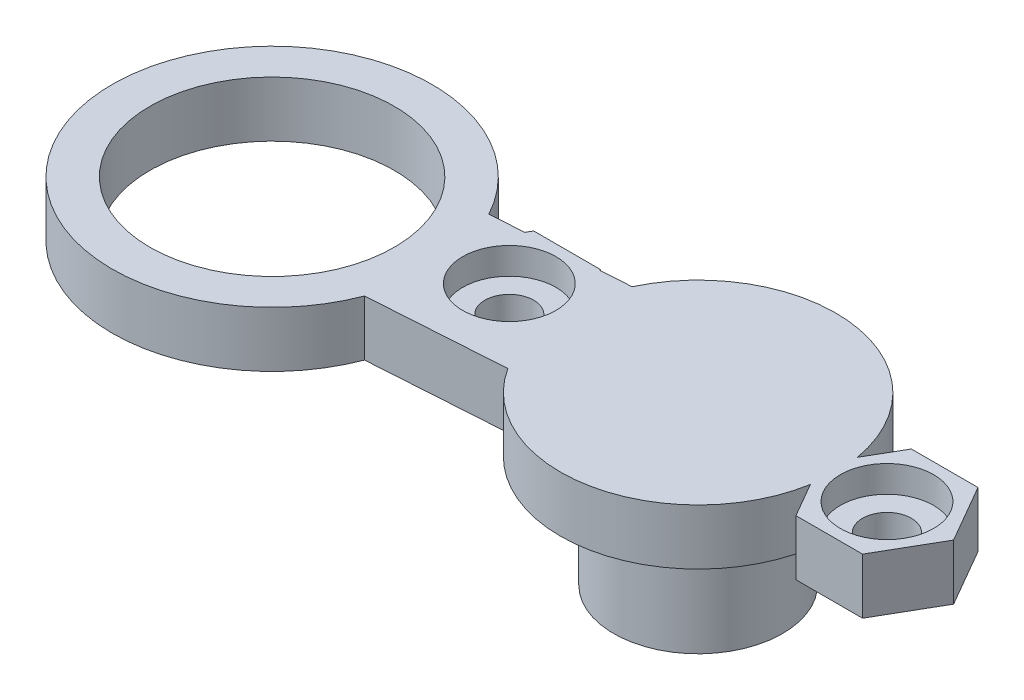
ISO-10303-21;
HEADER;
FILE_DESCRIPTION(('STEP AP214'),'2;1');
FILE_NAME('part.step','',(''),(''),'','','');
FILE_SCHEMA(('AUTOMOTIVE_DESIGN { 1 0 10303 214 1 1 1 1 }'));
ENDSEC;
DATA;
#1=APPLICATION_CONTEXT('core data for automotive mechanical design processes');
#2=APPLICATION_PROTOCOL_DEFINITION('international standard','automotive_design',2000,#1);
#3=PRODUCT_CONTEXT('',#1,'mechanical');
#4=PRODUCT('Part','Part','',(#3));
#5=PRODUCT_RELATED_PRODUCT_CATEGORY('part','',(#4));
#6=PRODUCT_DEFINITION_FORMATION('','',#4);
#7=PRODUCT_DEFINITION_CONTEXT('part definition',#1,'design');
#8=PRODUCT_DEFINITION('design','',#6,#7);
#9=PRODUCT_DEFINITION_SHAPE('','',#8);
#10=(LENGTH_UNIT() NAMED_UNIT(*) SI_UNIT(.MILLI.,.METRE.));
#11=(NAMED_UNIT(*) PLANE_ANGLE_UNIT() SI_UNIT($,.RADIAN.));
#12=(NAMED_UNIT(*) SI_UNIT($,.STERADIAN.) SOLID_ANGLE_UNIT());
#13=UNCERTAINTY_MEASURE_WITH_UNIT(LENGTH_MEASURE(1.E-05),#10,'distance_accuracy_value','');
#14=(GEOMETRIC_REPRESENTATION_CONTEXT(3) GLOBAL_UNCERTAINTY_ASSIGNED_CONTEXT((#13)) GLOBAL_UNIT_ASSIGNED_CONTEXT((#10,
#11,#12)) REPRESENTATION_CONTEXT('',''));
#15=CARTESIAN_POINT('',(0.,0.,0.));
#16=DIRECTION('',(0.,0.,1.));
#17=DIRECTION('',(1.,0.,0.));
#18=AXIS2_PLACEMENT_3D('',#15,#16,#17);
#19=CARTESIAN_POINT('',(-64.7916512459885,108.75,30.));
#20=DIRECTION('',(0.,-1.,0.));
#21=DIRECTION('',(0.,0.,1.));
#22=AXIS2_PLACEMENT_3D('',#19,#20,#21);
#23=CYLINDRICAL_SURFACE('',#22,1.1);
#24=CARTESIAN_POINT('',(-64.7916512459885,106.,30.));
#25=DIRECTION('',(0.,-1.,0.));
#26=DIRECTION('',(0.,0.,-1.));
#27=AXIS2_PLACEMENT_3D('',#24,#25,#26);
#28=CIRCLE('',#27,1.1);
#29=CARTESIAN_POINT('',(-64.7916512459885,106.,28.9));
#30=VERTEX_POINT('',#29);
#31=EDGE_CURVE('E205',#30,#30,#28,.F.);
#32=ORIENTED_EDGE('',*,*,#31,.F.);
#33=EDGE_LOOP('',(#32));
#34=FACE_BOUND('',#33,.T.);
#35=CARTESIAN_POINT('',(-64.7916512459885,107.3,30.));
#36=DIRECTION('',(0.,-1.,0.));
#37=DIRECTION('',(0.,0.,-1.));
#38=AXIS2_PLACEMENT_3D('',#35,#36,#37);
#39=CIRCLE('',#38,1.1);
#40=CARTESIAN_POINT('',(-64.7916512459885,107.3,28.9));
#41=VERTEX_POINT('',#40);
#42=EDGE_CURVE('E209',#41,#41,#39,.T.);
#43=ORIENTED_EDGE('',*,*,#42,.F.);
#44=EDGE_LOOP('',(#43));
#45=FACE_BOUND('',#44,.T.);
#46=ADVANCED_FACE('F41',(#34,#45),#23,.F.);
#47=CARTESIAN_POINT('',(-47.7916512459885,108.75,30.));
#48=DIRECTION('',(0.,-1.,0.));
#49=DIRECTION('',(0.,0.,1.));
#50=AXIS2_PLACEMENT_3D('',#47,#48,#49);
#51=CYLINDRICAL_SURFACE('',#50,1.1);
#52=CARTESIAN_POINT('',(-47.7916512459885,106.,30.));
#53=DIRECTION('',(0.,-1.,0.));
#54=DIRECTION('',(0.,0.,-1.));
#55=AXIS2_PLACEMENT_3D('',#52,#53,#54);
#56=CIRCLE('',#55,1.1);
#57=CARTESIAN_POINT('',(-47.7916512459885,106.,28.9));
#58=VERTEX_POINT('',#57);
#59=EDGE_CURVE('E192',#58,#58,#56,.F.);
#60=ORIENTED_EDGE('',*,*,#59,.F.);
#61=EDGE_LOOP('',(#60));
#62=FACE_BOUND('',#61,.T.);
#63=CARTESIAN_POINT('',(-47.7916512459885,107.3,30.));
#64=DIRECTION('',(0.,-1.,0.));
#65=DIRECTION('',(0.,0.,-1.));
#66=AXIS2_PLACEMENT_3D('',#63,#64,#65);
#67=CIRCLE('',#66,1.1);
#68=CARTESIAN_POINT('',(-47.7916512459885,107.3,28.9));
#69=VERTEX_POINT('',#68);
#70=EDGE_CURVE('E198',#69,#69,#67,.T.);
#71=ORIENTED_EDGE('',*,*,#70,.F.);
#72=EDGE_LOOP('',(#71));
#73=FACE_BOUND('',#72,.T.);
#74=ADVANCED_FACE('F355',(#62,#73),#51,.F.);
#75=CARTESIAN_POINT('',(-74.4873857240542,108.5,28.1833066771346));
#76=DIRECTION('',(0.0652448260218996,0.,0.997869286368396));
#77=DIRECTION('',(0.997869286368396,0.,-0.0652448260218996));
#78=AXIS2_PLACEMENT_3D('',#75,#76,#77);
#79=PLANE('',#78);
#80=DIRECTION('',(0.,-1.,0.));
#81=VECTOR('',#80,1.);
#82=CARTESIAN_POINT('',(-67.9561044602363,108.5,27.7562644627092));
#83=LINE('',#82,#81);
#84=CARTESIAN_POINT('',(-67.9561044602363,106.,27.7562644627092));
#85=VERTEX_POINT('',#84);
#86=CARTESIAN_POINT('',(-67.9561044602363,108.5,27.7562644627092));
#87=VERTEX_POINT('',#86);
#88=EDGE_CURVE('E236',#85,#87,#83,.F.);
#89=ORIENTED_EDGE('',*,*,#88,.T.);
#90=DIRECTION('',(0.997869286368396,0.,-0.0652448260218996));
#91=VECTOR('',#90,1.);
#92=CARTESIAN_POINT('',(-74.4873857240542,108.5,28.1833066771346));
#93=LINE('',#92,#91);
#94=CARTESIAN_POINT('',(-66.4389583443347,108.5,27.6570671672978));
#95=VERTEX_POINT('',#94);
#96=EDGE_CURVE('E234',#87,#95,#93,.T.);
#97=ORIENTED_EDGE('',*,*,#96,.T.);
#98=DIRECTION('',(0.,1.,0.));
#99=VECTOR('',#98,1.);
#100=CARTESIAN_POINT('',(-66.4389583443347,108.5,27.6570671672978));
#101=LINE('',#100,#99);
#102=CARTESIAN_POINT('',(-66.4389583443347,106.,27.6570671672978));
#103=VERTEX_POINT('',#102);
#104=EDGE_CURVE('E187',#103,#95,#101,.T.);
#105=ORIENTED_EDGE('',*,*,#104,.F.);
#106=DIRECTION('',(0.997869286368396,0.,-0.0652448260218996));
#107=VECTOR('',#106,1.);
#108=CARTESIAN_POINT('',(-74.4873857240542,106.,28.1833066771346));
#109=LINE('',#108,#107);
#110=EDGE_CURVE('E243',#85,#103,#109,.T.);
#111=ORIENTED_EDGE('',*,*,#110,.F.);
#112=EDGE_LOOP('',(#89,#97,#105,#111));
#113=FACE_BOUND('',#112,.T.);
#114=ADVANCED_FACE('F363',(#113),#79,.F.);
#115=CARTESIAN_POINT('',(-56.0959167679228,108.5,32.9936078591052));
#116=DIRECTION('',(-0.0652448260218995,0.,-0.997869286368396));
#117=DIRECTION('',(-0.997869286368396,0.,0.0652448260218995));
#118=AXIS2_PLACEMENT_3D('',#115,#116,#117);
#119=PLANE('',#118);
#120=DIRECTION('',(0.,-1.,0.));
#121=VECTOR('',#120,1.);
#122=CARTESIAN_POINT('',(-67.5646355041049,108.5,33.7434801809195));
#123=LINE('',#122,#121);
#124=CARTESIAN_POINT('',(-67.5646355041049,108.5,33.7434801809195));
#125=VERTEX_POINT('',#124);
#126=CARTESIAN_POINT('',(-67.5646355041049,106.,33.7434801809195));
#127=VERTEX_POINT('',#126);
#128=EDGE_CURVE('E49',#125,#127,#123,.T.);
#129=ORIENTED_EDGE('',*,*,#128,.T.);
#130=DIRECTION('',(-0.997869286368396,0.,0.0652448260218995));
#131=VECTOR('',#130,1.);
#132=CARTESIAN_POINT('',(-56.0959167679228,106.,32.9936078591052));
#133=LINE('',#132,#131);
#134=CARTESIAN_POINT('',(-61.5102197920638,106.,33.3476174109229));
#135=VERTEX_POINT('',#134);
#136=EDGE_CURVE('E252',#135,#127,#133,.T.);
#137=ORIENTED_EDGE('',*,*,#136,.F.);
#138=DIRECTION('',(0.,-1.,0.));
#139=VECTOR('',#138,1.);
#140=CARTESIAN_POINT('',(-61.5102197920638,108.5,33.3476174109229));
#141=LINE('',#140,#139);
#142=CARTESIAN_POINT('',(-61.5102197920638,108.5,33.3476174109229));
#143=VERTEX_POINT('',#142);
#144=EDGE_CURVE('E172',#143,#135,#141,.T.);
#145=ORIENTED_EDGE('',*,*,#144,.F.);
#146=DIRECTION('',(-0.997869286368396,0.,0.0652448260218995));
#147=VECTOR('',#146,1.);
#148=CARTESIAN_POINT('',(-56.0959167679228,108.5,32.9936078591052));
#149=LINE('',#148,#147);
#150=EDGE_CURVE('E233',#143,#125,#149,.T.);
#151=ORIENTED_EDGE('',*,*,#150,.T.);
#152=EDGE_LOOP('',(#129,#137,#145,#151));
#153=FACE_BOUND('',#152,.T.);
#154=ADVANCED_FACE('F239',(#153),#119,.F.);
#155=CARTESIAN_POINT('',(-56.2916512459885,108.5,30.));
#156=DIRECTION('',(0.,-1.,0.));
#157=DIRECTION('',(0.,0.,1.));
#158=AXIS2_PLACEMENT_3D('',#155,#156,#157);
#159=CYLINDRICAL_SURFACE('',#158,6.2);
#160=DIRECTION('',(0.,-1.,0.));
#161=VECTOR('',#160,1.);
#162=CARTESIAN_POINT('',(-61.9016887481952,108.5,27.3604016927125));
#163=LINE('',#162,#161);
#164=CARTESIAN_POINT('',(-61.9016887481952,106.,27.3604016927125));
#165=VERTEX_POINT('',#164);
#166=CARTESIAN_POINT('',(-61.9016887481952,108.5,27.3604016927125));
#167=VERTEX_POINT('',#166);
#168=EDGE_CURVE('E179',#165,#167,#163,.F.);
#169=ORIENTED_EDGE('',*,*,#168,.T.);
#170=CARTESIAN_POINT('',(-56.2916512459885,108.5,30.));
#171=DIRECTION('',(0.,-1.,0.));
#172=DIRECTION('',(0.,0.,-1.));
#173=AXIS2_PLACEMENT_3D('',#170,#171,#172);
#174=CIRCLE('',#173,6.2);
#175=CARTESIAN_POINT('',(-50.1821802837419,108.5,28.944365327651));
#176=VERTEX_POINT('',#175);
#177=EDGE_CURVE('E336',#167,#176,#174,.T.);
#178=ORIENTED_EDGE('',*,*,#177,.T.);
#179=DIRECTION('',(0.,-1.,0.));
#180=VECTOR('',#179,1.);
#181=CARTESIAN_POINT('',(-50.1821802837419,108.5,28.944365327651));
#182=LINE('',#181,#180);
#183=CARTESIAN_POINT('',(-50.1821802837419,106.,28.944365327651));
#184=VERTEX_POINT('',#183);
#185=EDGE_CURVE('E329',#176,#184,#182,.T.);
#186=ORIENTED_EDGE('',*,*,#185,.T.);
#187=CARTESIAN_POINT('',(-56.2916512459885,106.,30.));
#188=DIRECTION('',(0.,-1.,0.));
#189=DIRECTION('',(0.,0.,-1.));
#190=AXIS2_PLACEMENT_3D('',#187,#188,#189);
#191=CIRCLE('',#190,6.2);
#192=EDGE_CURVE('E333',#165,#184,#191,.T.);
#193=ORIENTED_EDGE('',*,*,#192,.F.);
#194=EDGE_LOOP('',(#169,#178,#186,#193));
#195=FACE_BOUND('',#194,.T.);
#196=ADVANCED_FACE('F388',(#195),#159,.T.);
#197=ORIENTED_EDGE('',*,*,#144,.T.);
#198=CARTESIAN_POINT('',(-50.1821802837419,106.,31.055634672349));
#199=VERTEX_POINT('',#198);
#200=EDGE_CURVE('E251',#199,#135,#191,.T.);
#201=ORIENTED_EDGE('',*,*,#200,.F.);
#202=DIRECTION('',(0.,-1.,0.));
#203=VECTOR('',#202,1.);
#204=CARTESIAN_POINT('',(-50.1821802837419,108.5,31.055634672349));
#205=LINE('',#204,#203);
#206=CARTESIAN_POINT('',(-50.1821802837419,108.5,31.055634672349));
#207=VERTEX_POINT('',#206);
#208=EDGE_CURVE('E331',#199,#207,#205,.F.);
#209=ORIENTED_EDGE('',*,*,#208,.T.);
#210=EDGE_CURVE('E335',#207,#143,#174,.T.);
#211=ORIENTED_EDGE('',*,*,#210,.T.);
#212=EDGE_LOOP('',(#197,#201,#209,#211));
#213=FACE_BOUND('',#212,.T.);
#214=ADVANCED_FACE('F404',(#213),#159,.T.);
#215=CARTESIAN_POINT('',(-63.2916512459885,108.5,27.4019237886467));
#216=DIRECTION('',(-0.866025403784438,0.,0.500000000000002));
#217=DIRECTION('',(0.500000000000002,0.,0.866025403784438));
#218=AXIS2_PLACEMENT_3D('',#215,#216,#217);
#219=PLANE('',#218);
#220=DIRECTION('',(0.,-1.,0.));
#221=VECTOR('',#220,1.);
#222=CARTESIAN_POINT('',(-63.264190219979,108.5,27.4494876809231));
#223=LINE('',#222,#221);
#224=CARTESIAN_POINT('',(-63.264190219979,108.5,27.4494876809231));
#225=VERTEX_POINT('',#224);
#226=CARTESIAN_POINT('',(-63.264190219979,106.,27.4494876809231));
#227=VERTEX_POINT('',#226);
#228=EDGE_CURVE('E261',#225,#227,#223,.T.);
#229=ORIENTED_EDGE('',*,*,#228,.T.);
#230=DIRECTION('',(0.500000000000002,0.,0.866025403784437));
#231=VECTOR('',#230,1.);
#232=CARTESIAN_POINT('',(-63.2916512459885,106.,27.4019237886467));
#233=LINE('',#232,#231);
#234=CARTESIAN_POINT('',(-63.2916512459885,106.,27.4019237886467));
#235=VERTEX_POINT('',#234);
#236=EDGE_CURVE('E173',#235,#227,#233,.T.);
#237=ORIENTED_EDGE('',*,*,#236,.F.);
#238=DIRECTION('',(0.,-1.,0.));
#239=VECTOR('',#238,1.);
#240=CARTESIAN_POINT('',(-63.2916512459885,108.5,27.4019237886467));
#241=LINE('',#240,#239);
#242=CARTESIAN_POINT('',(-63.2916512459885,108.5,27.4019237886467));
#243=VERTEX_POINT('',#242);
#244=EDGE_CURVE('E274',#243,#235,#241,.T.);
#245=ORIENTED_EDGE('',*,*,#244,.F.);
#246=DIRECTION('',(0.500000000000002,0.,0.866025403784437));
#247=VECTOR('',#246,1.);
#248=CARTESIAN_POINT('',(-63.2916512459885,108.5,27.4019237886467));
#249=LINE('',#248,#247);
#250=EDGE_CURVE('E266',#243,#225,#249,.T.);
#251=ORIENTED_EDGE('',*,*,#250,.T.);
#252=EDGE_LOOP('',(#229,#237,#245,#251));
#253=FACE_BOUND('',#252,.T.);
#254=ADVANCED_FACE('F400',(#253),#219,.F.);
#255=CARTESIAN_POINT('',(-67.7916512459885,108.5,30.));
#256=DIRECTION('',(0.866025403784439,0.,0.5));
#257=DIRECTION('',(0.5,0.,-0.866025403784439));
#258=AXIS2_PLACEMENT_3D('',#255,#256,#257);
#259=PLANE('',#258);
#260=ORIENTED_EDGE('',*,*,#104,.T.);
#261=DIRECTION('',(0.5,0.,-0.866025403784439));
#262=VECTOR('',#261,1.);
#263=CARTESIAN_POINT('',(-67.7916512459885,108.5,30.));
#264=LINE('',#263,#262);
#265=CARTESIAN_POINT('',(-66.2916512459885,108.5,27.4019237886467));
#266=VERTEX_POINT('',#265);
#267=EDGE_CURVE('E268',#95,#266,#264,.T.);
#268=ORIENTED_EDGE('',*,*,#267,.T.);
#269=DIRECTION('',(0.,-1.,0.));
#270=VECTOR('',#269,1.);
#271=CARTESIAN_POINT('',(-66.2916512459885,108.5,27.4019237886467));
#272=LINE('',#271,#270);
#273=CARTESIAN_POINT('',(-66.2916512459885,106.,27.4019237886467));
#274=VERTEX_POINT('',#273);
#275=EDGE_CURVE('E281',#266,#274,#272,.T.);
#276=ORIENTED_EDGE('',*,*,#275,.T.);
#277=DIRECTION('',(0.5,0.,-0.866025403784439));
#278=VECTOR('',#277,1.);
#279=CARTESIAN_POINT('',(-67.7916512459885,106.,30.));
#280=LINE('',#279,#278);
#281=EDGE_CURVE('E180',#103,#274,#280,.T.);
#282=ORIENTED_EDGE('',*,*,#281,.F.);
#283=EDGE_LOOP('',(#260,#268,#276,#282));
#284=FACE_BOUND('',#283,.T.);
#285=ADVANCED_FACE('F397',(#284),#259,.F.);
#286=CARTESIAN_POINT('',(-56.2916512459885,106.02,30.));
#287=DIRECTION('',(0.,-1.,0.));
#288=DIRECTION('',(0.,0.,1.));
#289=AXIS2_PLACEMENT_3D('',#286,#287,#288);
#290=CYLINDRICAL_SURFACE('',#289,3.8);
#291=CARTESIAN_POINT('',(-56.2916512459885,101.,30.));
#292=DIRECTION('',(0.,-1.,0.));
#293=DIRECTION('',(0.,0.,-1.));
#294=AXIS2_PLACEMENT_3D('',#291,#292,#293);
#295=CIRCLE('',#294,3.8);
#296=CARTESIAN_POINT('',(-54.9359840099452,101.,26.4500469939563));
#297=VERTEX_POINT('',#296);
#298=CARTESIAN_POINT('',(-59.7272686237187,101.,28.3762594930721));
#299=VERTEX_POINT('',#298);
#300=EDGE_CURVE('E340',#297,#299,#295,.T.);
#301=ORIENTED_EDGE('',*,*,#300,.F.);
#302=CARTESIAN_POINT('',(-59.7273489516052,100.9998,28.3764294670018));
#303=CARTESIAN_POINT('',(-59.6982439038354,101.072342110152,28.3147764275957));
#304=CARTESIAN_POINT('',(-59.6660169992389,101.141737029236,28.2509329767744));
#305=CARTESIAN_POINT('',(-59.5950317568943,101.2741615165,28.1203337966306));
#306=CARTESIAN_POINT('',(-59.5562732873464,101.337190956191,28.0535780085605));
#307=CARTESIAN_POINT('',(-59.4718849604281,101.456886305187,27.9185398759363));
#308=CARTESIAN_POINT('',(-59.4262464655611,101.513544056817,27.8502557056668));
#309=CARTESIAN_POINT('',(-59.3280102209679,101.620336946865,27.7136058462189));
#310=CARTESIAN_POINT('',(-59.275413628793,101.670473167462,27.6452401724701));
#311=CARTESIAN_POINT('',(-59.1697648271259,101.75869968596,27.5175588846148));
#312=CARTESIAN_POINT('',(-59.1174718743329,101.797512633648,27.4581126744177));
#313=CARTESIAN_POINT('',(-59.0075446232411,101.86987515176,27.340982992616));
#314=CARTESIAN_POINT('',(-58.9499108650743,101.903425253509,27.2832993435411));
#315=CARTESIAN_POINT('',(-58.829588730861,101.96510164616,27.1705726670172));
#316=CARTESIAN_POINT('',(-58.766908541791,101.9932364806,27.1155255847316));
#317=CARTESIAN_POINT('',(-58.6367115940562,102.044024535532,27.0087159270121));
#318=CARTESIAN_POINT('',(-58.5691950527587,102.066678002182,26.9569532041612));
#319=CARTESIAN_POINT('',(-58.4332338705856,102.105385136737,26.8598971112717));
#320=CARTESIAN_POINT('',(-58.3650059620865,102.121713025434,26.8144094242844));
#321=CARTESIAN_POINT('',(-58.2249628739849,102.149229670343,26.7275239293778));
#322=CARTESIAN_POINT('',(-58.1531463832196,102.160416532726,26.6861276330284));
#323=CARTESIAN_POINT('',(-58.0064787666214,102.17756924396,26.6079111196326));
#324=CARTESIAN_POINT('',(-57.9316284349337,102.183536450003,26.5710897151809));
#325=CARTESIAN_POINT('',(-57.7794638849164,102.190221249505,26.5023721303998));
#326=CARTESIAN_POINT('',(-57.7021488024539,102.190936981028,26.4704777008776));
#327=CARTESIAN_POINT('',(-57.4776665150802,102.185424591192,26.3864625353505));
#328=CARTESIAN_POINT('',(-57.3281235980046,102.172629334172,26.340818064506));
#329=CARTESIAN_POINT('',(-57.0272428885205,102.128913957545,26.2686617120777));
#330=CARTESIAN_POINT('',(-56.8759055905311,102.09799872196,26.2421446792175));
#331=CARTESIAN_POINT('',(-56.5753296224412,102.018550534102,26.2075776489179));
#332=CARTESIAN_POINT('',(-56.4260981620568,101.969967626041,26.1995804940757));
#333=CARTESIAN_POINT('',(-56.1342314946182,101.855858350757,26.2004542237596));
#334=CARTESIAN_POINT('',(-55.9916018695932,101.790317943255,26.2093391249562));
#335=CARTESIAN_POINT('',(-55.7076755223766,101.638024621455,26.2422449430599));
#336=CARTESIAN_POINT('',(-55.5670923720734,101.550154500006,26.2672291116562));
#337=CARTESIAN_POINT('',(-55.3020519967608,101.356314064967,26.3286057023343));
#338=CARTESIAN_POINT('',(-55.1775647209751,101.250378363221,26.364976418281));
#339=CARTESIAN_POINT('',(-55.0411277250355,101.113686188711,26.4115826842518));
#340=CARTESIAN_POINT('',(-55.0195246264958,101.091350519122,26.4191889526008));
#341=CARTESIAN_POINT('',(-54.9770907720098,101.046051944822,26.4345497948463));
#342=CARTESIAN_POINT('',(-54.9562592527024,101.023089701324,26.4423042099967));
#343=CARTESIAN_POINT('',(-54.9358083830805,100.9998,26.4501140678745));
#344=B_SPLINE_CURVE_WITH_KNOTS('',3,(#302,#303,#304,#305,#306,#307,#308,#309,#310,#311,#312,
#313,#314,#315,#316,#317,#318,#319,#320,#321,#322,#323,#324,#325,#326,#327,#328,#329,#330,#331,
#332,#333,#334,#335,#336,#337,#338,#339,#340,#341,#342,#343),.UNSPECIFIED.,.F.,.F.,(4,2,2,2,2,2,
2,2,2,2,2,2,2,2,2,2,2,2,2,2,4),(0.,0.298502367110101,0.597010758387172,0.895897080679055,
1.19473374252969,1.45893687456312,1.72311331603081,1.98686949351789,2.25061382405024,
2.50111827840571,2.75171493870104,3.00224642058705,3.25286672539202,3.72104449842144,
4.18909613775278,4.65848162776417,5.1282570049278,5.62913773764798,6.12906939821769,
6.22503537633686,6.32090372644182),.UNSPECIFIED.);
#345=EDGE_CURVE('E168',#299,#297,#344,.T.);
#346=ORIENTED_EDGE('',*,*,#345,.F.);
#347=EDGE_LOOP('',(#301,#346));
#348=FACE_BOUND('',#347,.T.);
#349=CARTESIAN_POINT('',(-56.2916512459885,106.,30.));
#350=DIRECTION('',(0.,-1.,0.));
#351=DIRECTION('',(0.,0.,-1.));
#352=AXIS2_PLACEMENT_3D('',#349,#350,#351);
#353=CIRCLE('',#352,3.8);
#354=CARTESIAN_POINT('',(-56.2916512459885,106.,26.2));
#355=VERTEX_POINT('',#354);
#356=EDGE_CURVE('E183',#355,#355,#353,.T.);
#357=ORIENTED_EDGE('',*,*,#356,.T.);
#358=EDGE_LOOP('',(#357));
#359=FACE_BOUND('',#358,.T.);
#360=ADVANCED_FACE('F43',(#348,#359),#290,.T.);
#361=CARTESIAN_POINT('',(-56.2916512459885,101.,30.));
#362=DIRECTION('',(0.,1.,0.));
#363=DIRECTION('',(0.,0.,-1.));
#364=AXIS2_PLACEMENT_3D('',#361,#362,#363);
#365=PLANE('',#364);
#366=ORIENTED_EDGE('',*,*,#300,.T.);
#367=CARTESIAN_POINT('',(-57.2135245359946,101.,27.7069210628203));
#368=DIRECTION('',(0.,-1.,0.));
#369=DIRECTION('',(-0.373009193509687,0.,-0.927827646471721));
#370=AXIS2_PLACEMENT_3D('',#367,#368,#369);
#371=ELLIPSE('',#370,5.40311255334577,2.58643522865269);
#372=CARTESIAN_POINT('',(-59.3547037914325,101.,29.2650108137878));
#373=VERTEX_POINT('',#372);
#374=EDGE_CURVE('E167',#373,#299,#371,.T.);
#375=ORIENTED_EDGE('',*,*,#374,.F.);
#376=CARTESIAN_POINT('',(-56.2916512459885,101.,30.));
#377=DIRECTION('',(0.,-1.,0.));
#378=DIRECTION('',(0.,0.,-1.));
#379=AXIS2_PLACEMENT_3D('',#376,#377,#378);
#380=CIRCLE('',#379,3.15);
#381=CARTESIAN_POINT('',(-54.5897018221519,101.,27.3493645745402));
#382=VERTEX_POINT('',#381);
#383=EDGE_CURVE('E160',#382,#373,#380,.T.);
#384=ORIENTED_EDGE('',*,*,#383,.F.);
#385=EDGE_CURVE('E161',#297,#382,#371,.T.);
#386=ORIENTED_EDGE('',*,*,#385,.F.);
#387=EDGE_LOOP('',(#366,#375,#384,#386));
#388=FACE_BOUND('',#387,.T.);
#389=ADVANCED_FACE('F175',(#388),#365,.F.);
#390=CARTESIAN_POINT('',(-56.2916512459885,108.5,30.));
#391=DIRECTION('',(0.,1.,0.));
#392=DIRECTION('',(0.,0.,-1.));
#393=AXIS2_PLACEMENT_3D('',#390,#391,#392);
#394=PLANE('',#393);
#395=CARTESIAN_POINT('',(-64.7916512459885,108.5,30.));
#396=DIRECTION('',(0.,-1.,0.));
#397=DIRECTION('',(0.,0.,-1.));
#398=AXIS2_PLACEMENT_3D('',#395,#396,#397);
#399=CIRCLE('',#398,2.1);
#400=CARTESIAN_POINT('',(-64.7916512459885,108.5,27.9));
#401=VERTEX_POINT('',#400);
#402=EDGE_CURVE('E206',#401,#401,#399,.F.);
#403=ORIENTED_EDGE('',*,*,#402,.F.);
#404=EDGE_LOOP('',(#403));
#405=FACE_BOUND('',#404,.T.);
#406=CARTESIAN_POINT('',(-47.7916512459885,108.5,30.));
#407=DIRECTION('',(0.,-1.,0.));
#408=DIRECTION('',(0.,0.,-1.));
#409=AXIS2_PLACEMENT_3D('',#406,#407,#408);
#410=CIRCLE('',#409,2.1);
#411=CARTESIAN_POINT('',(-47.7916512459885,108.5,27.9));
#412=VERTEX_POINT('',#411);
#413=EDGE_CURVE('E199',#412,#412,#410,.F.);
#414=ORIENTED_EDGE('',*,*,#413,.F.);
#415=EDGE_LOOP('',(#414));
#416=FACE_BOUND('',#415,.T.);
#417=CARTESIAN_POINT('',(-74.2916512459885,108.5,31.1769145362398));
#418=DIRECTION('',(0.,-1.,0.));
#419=DIRECTION('',(0.,0.,-1.));
#420=AXIS2_PLACEMENT_3D('',#417,#418,#419);
#421=CIRCLE('',#420,5.50000000000001);
#422=CARTESIAN_POINT('',(-74.2916512459885,108.5,36.6769145362398));
#423=VERTEX_POINT('',#422);
#424=EDGE_CURVE('E193',#423,#423,#421,.F.);
#425=ORIENTED_EDGE('',*,*,#424,.F.);
#426=EDGE_LOOP('',(#425));
#427=FACE_BOUND('',#426,.T.);
#428=CARTESIAN_POINT('',(-74.2916512459885,108.5,31.1769145362398));
#429=DIRECTION('',(0.,-1.,0.));
#430=DIRECTION('',(0.,0.,-1.));
#431=AXIS2_PLACEMENT_3D('',#428,#429,#430);
#432=CIRCLE('',#431,7.2);
#433=EDGE_CURVE('E65',#125,#87,#432,.T.);
#434=ORIENTED_EDGE('',*,*,#433,.F.);
#435=ORIENTED_EDGE('',*,*,#150,.F.);
#436=ORIENTED_EDGE('',*,*,#210,.F.);
#437=DIRECTION('',(-0.5,0.,-0.866025403784439));
#438=VECTOR('',#437,1.);
#439=CARTESIAN_POINT('',(-49.2916512459885,108.5,32.5980762113533));
#440=LINE('',#439,#438);
#441=CARTESIAN_POINT('',(-49.2916512459885,108.5,32.5980762113533));
#442=VERTEX_POINT('',#441);
#443=EDGE_CURVE('E294',#442,#207,#440,.T.);
#444=ORIENTED_EDGE('',*,*,#443,.F.);
#445=DIRECTION('',(-1.,0.,0.));
#446=VECTOR('',#445,1.);
#447=CARTESIAN_POINT('',(-46.2916512459885,108.5,32.5980762113533));
#448=LINE('',#447,#446);
#449=CARTESIAN_POINT('',(-46.2916512459885,108.5,32.5980762113533));
#450=VERTEX_POINT('',#449);
#451=EDGE_CURVE('E292',#450,#442,#448,.T.);
#452=ORIENTED_EDGE('',*,*,#451,.F.);
#453=DIRECTION('',(-0.5,0.,0.866025403784439));
#454=VECTOR('',#453,1.);
#455=CARTESIAN_POINT('',(-44.7916512459885,108.5,30.));
#456=LINE('',#455,#454);
#457=CARTESIAN_POINT('',(-44.7916512459885,108.5,30.));
#458=VERTEX_POINT('',#457);
#459=EDGE_CURVE('E289',#458,#450,#456,.T.);
#460=ORIENTED_EDGE('',*,*,#459,.F.);
#461=DIRECTION('',(0.500000000000001,0.,0.866025403784438));
#462=VECTOR('',#461,1.);
#463=CARTESIAN_POINT('',(-46.2916512459885,108.5,27.4019237886467));
#464=LINE('',#463,#462);
#465=CARTESIAN_POINT('',(-46.2916512459885,108.5,27.4019237886467));
#466=VERTEX_POINT('',#465);
#467=EDGE_CURVE('E285',#466,#458,#464,.T.);
#468=ORIENTED_EDGE('',*,*,#467,.F.);
#469=DIRECTION('',(1.,0.,0.));
#470=VECTOR('',#469,1.);
#471=CARTESIAN_POINT('',(-49.2916512459885,108.5,27.4019237886467));
#472=LINE('',#471,#470);
#473=CARTESIAN_POINT('',(-49.2916512459885,108.5,27.4019237886467));
#474=VERTEX_POINT('',#473);
#475=EDGE_CURVE('E297',#474,#466,#472,.T.);
#476=ORIENTED_EDGE('',*,*,#475,.F.);
#477=DIRECTION('',(0.500000000000001,0.,-0.866025403784438));
#478=VECTOR('',#477,1.);
#479=CARTESIAN_POINT('',(-50.7916512459885,108.5,30.));
#480=LINE('',#479,#478);
#481=EDGE_CURVE('E300',#176,#474,#480,.T.);
#482=ORIENTED_EDGE('',*,*,#481,.F.);
#483=ORIENTED_EDGE('',*,*,#177,.F.);
#484=EDGE_CURVE('E245',#225,#167,#93,.T.);
#485=ORIENTED_EDGE('',*,*,#484,.F.);
#486=ORIENTED_EDGE('',*,*,#250,.F.);
#487=DIRECTION('',(1.,0.,0.));
#488=VECTOR('',#487,1.);
#489=CARTESIAN_POINT('',(-66.2916512459885,108.5,27.4019237886467));
#490=LINE('',#489,#488);
#491=EDGE_CURVE('E271',#266,#243,#490,.T.);
#492=ORIENTED_EDGE('',*,*,#491,.F.);
#493=ORIENTED_EDGE('',*,*,#267,.F.);
#494=ORIENTED_EDGE('',*,*,#96,.F.);
#495=EDGE_LOOP('',(#434,#435,#436,#444,#452,#460,#468,#476,#482,#483,#485,#486,#492,#493,#494));
#496=FACE_BOUND('',#495,.T.);
#497=ADVANCED_FACE('F219',(#405,#416,#427,#496),#394,.T.);
#498=CARTESIAN_POINT('',(-56.2916512459885,106.,30.));
#499=DIRECTION('',(0.,1.,0.));
#500=DIRECTION('',(0.,0.,-1.));
#501=AXIS2_PLACEMENT_3D('',#498,#499,#500);
#502=PLANE('',#501);
#503=ORIENTED_EDGE('',*,*,#31,.T.);
#504=EDGE_LOOP('',(#503));
#505=FACE_BOUND('',#504,.T.);
#506=ORIENTED_EDGE('',*,*,#59,.T.);
#507=EDGE_LOOP('',(#506));
#508=FACE_BOUND('',#507,.T.);
#509=CARTESIAN_POINT('',(-74.2916512459885,106.,31.1769145362398));
#510=DIRECTION('',(0.,-1.,0.));
#511=DIRECTION('',(0.,0.,-1.));
#512=AXIS2_PLACEMENT_3D('',#509,#510,#511);
#513=CIRCLE('',#512,5.50000000000001);
#514=CARTESIAN_POINT('',(-74.2916512459885,106.,36.6769145362398));
#515=VERTEX_POINT('',#514);
#516=EDGE_CURVE('E194',#515,#515,#513,.F.);
#517=ORIENTED_EDGE('',*,*,#516,.T.);
#518=EDGE_LOOP('',(#517));
#519=FACE_BOUND('',#518,.T.);
#520=ORIENTED_EDGE('',*,*,#110,.T.);
#521=ORIENTED_EDGE('',*,*,#281,.T.);
#522=DIRECTION('',(1.,0.,0.));
#523=VECTOR('',#522,1.);
#524=CARTESIAN_POINT('',(-66.2916512459885,106.,27.4019237886467));
#525=LINE('',#524,#523);
#526=EDGE_CURVE('E270',#274,#235,#525,.T.);
#527=ORIENTED_EDGE('',*,*,#526,.T.);
#528=ORIENTED_EDGE('',*,*,#236,.T.);
#529=EDGE_CURVE('E253',#227,#165,#109,.T.);
#530=ORIENTED_EDGE('',*,*,#529,.T.);
#531=ORIENTED_EDGE('',*,*,#192,.T.);
#532=DIRECTION('',(0.500000000000001,0.,-0.866025403784438));
#533=VECTOR('',#532,1.);
#534=CARTESIAN_POINT('',(-50.7916512459885,106.,30.));
#535=LINE('',#534,#533);
#536=CARTESIAN_POINT('',(-49.2916512459885,106.,27.4019237886467));
#537=VERTEX_POINT('',#536);
#538=EDGE_CURVE('E313',#184,#537,#535,.T.);
#539=ORIENTED_EDGE('',*,*,#538,.T.);
#540=DIRECTION('',(1.,0.,0.));
#541=VECTOR('',#540,1.);
#542=CARTESIAN_POINT('',(-49.2916512459885,106.,27.4019237886467));
#543=LINE('',#542,#541);
#544=CARTESIAN_POINT('',(-46.2916512459885,106.,27.4019237886467));
#545=VERTEX_POINT('',#544);
#546=EDGE_CURVE('E288',#537,#545,#543,.T.);
#547=ORIENTED_EDGE('',*,*,#546,.T.);
#548=DIRECTION('',(0.500000000000001,0.,0.866025403784438));
#549=VECTOR('',#548,1.);
#550=CARTESIAN_POINT('',(-46.2916512459885,106.,27.4019237886467));
#551=LINE('',#550,#549);
#552=CARTESIAN_POINT('',(-44.7916512459885,106.,30.));
#553=VERTEX_POINT('',#552);
#554=EDGE_CURVE('E283',#545,#553,#551,.T.);
#555=ORIENTED_EDGE('',*,*,#554,.T.);
#556=DIRECTION('',(-0.5,0.,0.866025403784439));
#557=VECTOR('',#556,1.);
#558=CARTESIAN_POINT('',(-44.7916512459885,106.,30.));
#559=LINE('',#558,#557);
#560=CARTESIAN_POINT('',(-46.2916512459885,106.,32.5980762113533));
#561=VERTEX_POINT('',#560);
#562=EDGE_CURVE('E306',#553,#561,#559,.T.);
#563=ORIENTED_EDGE('',*,*,#562,.T.);
#564=DIRECTION('',(-1.,0.,0.));
#565=VECTOR('',#564,1.);
#566=CARTESIAN_POINT('',(-46.2916512459885,106.,32.5980762113533));
#567=LINE('',#566,#565);
#568=CARTESIAN_POINT('',(-49.2916512459885,106.,32.5980762113533));
#569=VERTEX_POINT('',#568);
#570=EDGE_CURVE('E307',#561,#569,#567,.T.);
#571=ORIENTED_EDGE('',*,*,#570,.T.);
#572=DIRECTION('',(-0.5,0.,-0.866025403784439));
#573=VECTOR('',#572,1.);
#574=CARTESIAN_POINT('',(-49.2916512459885,106.,32.5980762113533));
#575=LINE('',#574,#573);
#576=EDGE_CURVE('E315',#569,#199,#575,.T.);
#577=ORIENTED_EDGE('',*,*,#576,.T.);
#578=ORIENTED_EDGE('',*,*,#200,.T.);
#579=ORIENTED_EDGE('',*,*,#136,.T.);
#580=CARTESIAN_POINT('',(-74.2916512459885,106.,31.1769145362398));
#581=DIRECTION('',(0.,-1.,0.));
#582=DIRECTION('',(0.,0.,-1.));
#583=AXIS2_PLACEMENT_3D('',#580,#581,#582);
#584=CIRCLE('',#583,7.2);
#585=EDGE_CURVE('E240',#127,#85,#584,.T.);
#586=ORIENTED_EDGE('',*,*,#585,.T.);
#587=EDGE_LOOP('',(#520,#521,#527,#528,#530,#531,#539,#547,#555,#563,#571,#577,#578,#579,#586));
#588=FACE_BOUND('',#587,.T.);
#589=ORIENTED_EDGE('',*,*,#356,.F.);
#590=EDGE_LOOP('',(#589));
#591=FACE_BOUND('',#590,.T.);
#592=ADVANCED_FACE('F221',(#505,#508,#519,#588,#591),#502,.F.);
#593=CARTESIAN_POINT('',(-49.2916512459885,108.5,32.5980762113533));
#594=DIRECTION('',(0.866025403784439,0.,-0.5));
#595=DIRECTION('',(-0.5,0.,-0.866025403784439));
#596=AXIS2_PLACEMENT_3D('',#593,#594,#595);
#597=PLANE('',#596);
#598=ORIENTED_EDGE('',*,*,#576,.F.);
#599=DIRECTION('',(0.,-1.,0.));
#600=VECTOR('',#599,1.);
#601=CARTESIAN_POINT('',(-49.2916512459885,108.5,32.5980762113533));
#602=LINE('',#601,#600);
#603=EDGE_CURVE('E321',#442,#569,#602,.T.);
#604=ORIENTED_EDGE('',*,*,#603,.F.);
#605=ORIENTED_EDGE('',*,*,#443,.T.);
#606=ORIENTED_EDGE('',*,*,#208,.F.);
#607=EDGE_LOOP('',(#598,#604,#605,#606));
#608=FACE_BOUND('',#607,.T.);
#609=ADVANCED_FACE('F345',(#608),#597,.F.);
#610=CARTESIAN_POINT('',(-50.7916512459885,108.5,30.));
#611=DIRECTION('',(0.866025403784438,0.,0.500000000000001));
#612=DIRECTION('',(0.500000000000001,0.,-0.866025403784438));
#613=AXIS2_PLACEMENT_3D('',#610,#611,#612);
#614=PLANE('',#613);
#615=ORIENTED_EDGE('',*,*,#481,.T.);
#616=DIRECTION('',(0.,-1.,0.));
#617=VECTOR('',#616,1.);
#618=CARTESIAN_POINT('',(-49.2916512459885,108.5,27.4019237886467));
#619=LINE('',#618,#617);
#620=EDGE_CURVE('E318',#474,#537,#619,.T.);
#621=ORIENTED_EDGE('',*,*,#620,.T.);
#622=ORIENTED_EDGE('',*,*,#538,.F.);
#623=ORIENTED_EDGE('',*,*,#185,.F.);
#624=EDGE_LOOP('',(#615,#621,#622,#623));
#625=FACE_BOUND('',#624,.T.);
#626=ADVANCED_FACE('F348',(#625),#614,.F.);
#627=CARTESIAN_POINT('',(-46.2916512459885,108.5,27.4019237886467));
#628=DIRECTION('',(-0.866025403784438,0.,0.500000000000001));
#629=DIRECTION('',(0.500000000000001,0.,0.866025403784438));
#630=AXIS2_PLACEMENT_3D('',#627,#628,#629);
#631=PLANE('',#630);
#632=ORIENTED_EDGE('',*,*,#554,.F.);
#633=DIRECTION('',(0.,-1.,0.));
#634=VECTOR('',#633,1.);
#635=CARTESIAN_POINT('',(-46.2916512459885,108.5,27.4019237886467));
#636=LINE('',#635,#634);
#637=EDGE_CURVE('E303',#466,#545,#636,.T.);
#638=ORIENTED_EDGE('',*,*,#637,.F.);
#639=ORIENTED_EDGE('',*,*,#467,.T.);
#640=DIRECTION('',(0.,-1.,0.));
#641=VECTOR('',#640,1.);
#642=CARTESIAN_POINT('',(-44.7916512459885,108.5,30.));
#643=LINE('',#642,#641);
#644=EDGE_CURVE('E326',#458,#553,#643,.T.);
#645=ORIENTED_EDGE('',*,*,#644,.T.);
#646=EDGE_LOOP('',(#632,#638,#639,#645));
#647=FACE_BOUND('',#646,.T.);
#648=ADVANCED_FACE('F411',(#647),#631,.F.);
#649=CARTESIAN_POINT('',(-44.7916512459885,108.5,30.));
#650=DIRECTION('',(-0.866025403784439,0.,-0.5));
#651=DIRECTION('',(-0.5,0.,0.866025403784439));
#652=AXIS2_PLACEMENT_3D('',#649,#650,#651);
#653=PLANE('',#652);
#654=ORIENTED_EDGE('',*,*,#562,.F.);
#655=ORIENTED_EDGE('',*,*,#644,.F.);
#656=ORIENTED_EDGE('',*,*,#459,.T.);
#657=DIRECTION('',(0.,-1.,0.));
#658=VECTOR('',#657,1.);
#659=CARTESIAN_POINT('',(-46.2916512459885,108.5,32.5980762113533));
#660=LINE('',#659,#658);
#661=EDGE_CURVE('E323',#450,#561,#660,.T.);
#662=ORIENTED_EDGE('',*,*,#661,.T.);
#663=EDGE_LOOP('',(#654,#655,#656,#662));
#664=FACE_BOUND('',#663,.T.);
#665=ADVANCED_FACE('F416',(#664),#653,.F.);
#666=CARTESIAN_POINT('',(-46.2916512459885,108.5,32.5980762113533));
#667=DIRECTION('',(0.,0.,-1.));
#668=DIRECTION('',(-1.,0.,0.));
#669=AXIS2_PLACEMENT_3D('',#666,#667,#668);
#670=PLANE('',#669);
#671=ORIENTED_EDGE('',*,*,#570,.F.);
#672=ORIENTED_EDGE('',*,*,#661,.F.);
#673=ORIENTED_EDGE('',*,*,#451,.T.);
#674=ORIENTED_EDGE('',*,*,#603,.T.);
#675=EDGE_LOOP('',(#671,#672,#673,#674));
#676=FACE_BOUND('',#675,.T.);
#677=ADVANCED_FACE('F410',(#676),#670,.F.);
#678=CARTESIAN_POINT('',(-49.2916512459885,108.5,27.4019237886467));
#679=DIRECTION('',(0.,0.,1.));
#680=DIRECTION('',(1.,0.,0.));
#681=AXIS2_PLACEMENT_3D('',#678,#679,#680);
#682=PLANE('',#681);
#683=ORIENTED_EDGE('',*,*,#546,.F.);
#684=ORIENTED_EDGE('',*,*,#620,.F.);
#685=ORIENTED_EDGE('',*,*,#475,.T.);
#686=ORIENTED_EDGE('',*,*,#637,.T.);
#687=EDGE_LOOP('',(#683,#684,#685,#686));
#688=FACE_BOUND('',#687,.T.);
#689=ADVANCED_FACE('F395',(#688),#682,.F.);
#690=CARTESIAN_POINT('',(-66.2916512459885,108.5,27.4019237886467));
#691=DIRECTION('',(0.,0.,1.));
#692=DIRECTION('',(1.,0.,0.));
#693=AXIS2_PLACEMENT_3D('',#690,#691,#692);
#694=PLANE('',#693);
#695=ORIENTED_EDGE('',*,*,#526,.F.);
#696=ORIENTED_EDGE('',*,*,#275,.F.);
#697=ORIENTED_EDGE('',*,*,#491,.T.);
#698=ORIENTED_EDGE('',*,*,#244,.T.);
#699=EDGE_LOOP('',(#695,#696,#697,#698));
#700=FACE_BOUND('',#699,.T.);
#701=ADVANCED_FACE('F392',(#700),#694,.F.);
#702=CARTESIAN_POINT('',(-56.2916512459885,101.,30.));
#703=DIRECTION('',(0.,0.,-1.));
#704=DIRECTION('',(-1.,0.,0.));
#705=AXIS2_PLACEMENT_3D('',#702,#703,#704);
#706=SPHERICAL_SURFACE('',#705,3.15);
#707=ORIENTED_EDGE('',*,*,#383,.T.);
#708=CARTESIAN_POINT('',(-56.7749951553088,100.17230473673,28.7977244271074));
#709=DIRECTION('',(-0.314352663124664,-0.538308656109163,-0.781924672807028));
#710=DIRECTION('',(0.,0.823680084758126,-0.567054775108055));
#711=AXIS2_PLACEMENT_3D('',#708,#709,#710);
#712=CIRCLE('',#711,2.74924219800813);
#713=EDGE_CURVE('E11',#382,#373,#712,.F.);
#714=ORIENTED_EDGE('',*,*,#713,.F.);
#715=EDGE_LOOP('',(#707,#714));
#716=FACE_BOUND('',#715,.T.);
#717=ADVANCED_FACE('F159',(#716),#706,.F.);
#718=ORIENTED_EDGE('',*,*,#529,.F.);
#719=ORIENTED_EDGE('',*,*,#228,.F.);
#720=ORIENTED_EDGE('',*,*,#484,.T.);
#721=ORIENTED_EDGE('',*,*,#168,.F.);
#722=EDGE_LOOP('',(#718,#719,#720,#721));
#723=FACE_BOUND('',#722,.T.);
#724=ADVANCED_FACE('F384',(#723),#79,.F.);
#725=CARTESIAN_POINT('',(-74.2916512459885,108.5,31.1769145362398));
#726=DIRECTION('',(0.,-1.,0.));
#727=DIRECTION('',(0.,0.,1.));
#728=AXIS2_PLACEMENT_3D('',#725,#726,#727);
#729=CYLINDRICAL_SURFACE('',#728,7.2);
#730=ORIENTED_EDGE('',*,*,#585,.F.);
#731=ORIENTED_EDGE('',*,*,#128,.F.);
#732=ORIENTED_EDGE('',*,*,#433,.T.);
#733=ORIENTED_EDGE('',*,*,#88,.F.);
#734=EDGE_LOOP('',(#730,#731,#732,#733));
#735=FACE_BOUND('',#734,.T.);
#736=ADVANCED_FACE('F244',(#735),#729,.T.);
#737=CARTESIAN_POINT('',(-74.2916512459885,108.6,31.1769145362398));
#738=DIRECTION('',(0.,-1.,0.));
#739=DIRECTION('',(0.,0.,1.));
#740=AXIS2_PLACEMENT_3D('',#737,#738,#739);
#741=CYLINDRICAL_SURFACE('',#740,5.50000000000001);
#742=CARTESIAN_POINT('',(-74.2916512459885,108.5,36.6769145362398));
#743=CARTESIAN_POINT('',(-74.2916512459885,108.473958333333,36.6769145362398));
#744=CARTESIAN_POINT('',(-74.2916512459885,108.447916666667,36.6769145362398));
#745=CARTESIAN_POINT('',(-74.2916512459885,108.395833333333,36.6769145362398));
#746=CARTESIAN_POINT('',(-74.2916512459885,108.369791666667,36.6769145362398));
#747=CARTESIAN_POINT('',(-74.2916512459885,108.317708333333,36.6769145362398));
#748=CARTESIAN_POINT('',(-74.2916512459885,108.291666666667,36.6769145362398));
#749=CARTESIAN_POINT('',(-74.2916512459885,108.239583333333,36.6769145362398));
#750=CARTESIAN_POINT('',(-74.2916512459885,108.213541666667,36.6769145362398));
#751=CARTESIAN_POINT('',(-74.2916512459885,108.161458333333,36.6769145362398));
#752=CARTESIAN_POINT('',(-74.2916512459885,108.135416666667,36.6769145362398));
#753=CARTESIAN_POINT('',(-74.2916512459885,108.083333333333,36.6769145362398));
#754=CARTESIAN_POINT('',(-74.2916512459885,108.057291666667,36.6769145362398));
#755=CARTESIAN_POINT('',(-74.2916512459885,108.005208333333,36.6769145362398));
#756=CARTESIAN_POINT('',(-74.2916512459885,107.979166666667,36.6769145362398));
#757=CARTESIAN_POINT('',(-74.2916512459885,107.927083333333,36.6769145362398));
#758=CARTESIAN_POINT('',(-74.2916512459885,107.901041666667,36.6769145362398));
#759=CARTESIAN_POINT('',(-74.2916512459885,107.848958333333,36.6769145362398));
#760=CARTESIAN_POINT('',(-74.2916512459885,107.822916666667,36.6769145362398));
#761=CARTESIAN_POINT('',(-74.2916512459885,107.770833333333,36.6769145362398));
#762=CARTESIAN_POINT('',(-74.2916512459885,107.744791666667,36.6769145362398));
#763=CARTESIAN_POINT('',(-74.2916512459885,107.692708333333,36.6769145362398));
#764=CARTESIAN_POINT('',(-74.2916512459885,107.666666666667,36.6769145362398));
#765=CARTESIAN_POINT('',(-74.2916512459885,107.614583333333,36.6769145362398));
#766=CARTESIAN_POINT('',(-74.2916512459885,107.588541666667,36.6769145362398));
#767=CARTESIAN_POINT('',(-74.2916512459885,107.536458333333,36.6769145362398));
#768=CARTESIAN_POINT('',(-74.2916512459885,107.510416666667,36.6769145362398));
#769=CARTESIAN_POINT('',(-74.2916512459885,107.458333333333,36.6769145362398));
#770=CARTESIAN_POINT('',(-74.2916512459885,107.432291666667,36.6769145362398));
#771=CARTESIAN_POINT('',(-74.2916512459885,107.380208333333,36.6769145362398));
#772=CARTESIAN_POINT('',(-74.2916512459885,107.354166666667,36.6769145362398));
#773=CARTESIAN_POINT('',(-74.2916512459885,107.302083333333,36.6769145362398));
#774=CARTESIAN_POINT('',(-74.2916512459885,107.276041666667,36.6769145362398));
#775=CARTESIAN_POINT('',(-74.2916512459885,107.223958333333,36.6769145362398));
#776=CARTESIAN_POINT('',(-74.2916512459885,107.197916666667,36.6769145362398));
#777=CARTESIAN_POINT('',(-74.2916512459885,107.145833333333,36.6769145362398));
#778=CARTESIAN_POINT('',(-74.2916512459885,107.119791666667,36.6769145362398));
#779=CARTESIAN_POINT('',(-74.2916512459885,107.067708333333,36.6769145362398));
#780=CARTESIAN_POINT('',(-74.2916512459885,107.041666666667,36.6769145362398));
#781=CARTESIAN_POINT('',(-74.2916512459885,106.989583333333,36.6769145362398));
#782=CARTESIAN_POINT('',(-74.2916512459885,106.963541666667,36.6769145362398));
#783=CARTESIAN_POINT('',(-74.2916512459885,106.911458333333,36.6769145362398));
#784=CARTESIAN_POINT('',(-74.2916512459885,106.885416666667,36.6769145362398));
#785=CARTESIAN_POINT('',(-74.2916512459885,106.833333333333,36.6769145362398));
#786=CARTESIAN_POINT('',(-74.2916512459885,106.807291666667,36.6769145362398));
#787=CARTESIAN_POINT('',(-74.2916512459885,106.755208333333,36.6769145362398));
#788=CARTESIAN_POINT('',(-74.2916512459885,106.729166666667,36.6769145362398));
#789=CARTESIAN_POINT('',(-74.2916512459885,106.677083333333,36.6769145362398));
#790=CARTESIAN_POINT('',(-74.2916512459885,106.651041666667,36.6769145362398));
#791=CARTESIAN_POINT('',(-74.2916512459885,106.598958333333,36.6769145362398));
#792=CARTESIAN_POINT('',(-74.2916512459885,106.572916666667,36.6769145362398));
#793=CARTESIAN_POINT('',(-74.2916512459885,106.520833333333,36.6769145362398));
#794=CARTESIAN_POINT('',(-74.2916512459885,106.494791666667,36.6769145362398));
#795=CARTESIAN_POINT('',(-74.2916512459885,106.442708333333,36.6769145362398));
#796=CARTESIAN_POINT('',(-74.2916512459885,106.416666666667,36.6769145362398));
#797=CARTESIAN_POINT('',(-74.2916512459885,106.364583333333,36.6769145362398));
#798=CARTESIAN_POINT('',(-74.2916512459885,106.338541666667,36.6769145362398));
#799=CARTESIAN_POINT('',(-74.2916512459885,106.286458333333,36.6769145362398));
#800=CARTESIAN_POINT('',(-74.2916512459885,106.260416666667,36.6769145362398));
#801=CARTESIAN_POINT('',(-74.2916512459885,106.208333333333,36.6769145362398));
#802=CARTESIAN_POINT('',(-74.2916512459885,106.182291666667,36.6769145362398));
#803=CARTESIAN_POINT('',(-74.2916512459885,106.130208333333,36.6769145362398));
#804=CARTESIAN_POINT('',(-74.2916512459885,106.104166666667,36.6769145362398));
#805=CARTESIAN_POINT('',(-74.2916512459885,106.052083333333,36.6769145362398));
#806=CARTESIAN_POINT('',(-74.2916512459885,106.026041666667,36.6769145362398));
#807=CARTESIAN_POINT('',(-74.2916512459885,106.,36.6769145362398));
#808=B_SPLINE_CURVE_WITH_KNOTS('',3,(#742,#743,#744,#745,#746,#747,#748,#749,#750,#751,#752,
#753,#754,#755,#756,#757,#758,#759,#760,#761,#762,#763,#764,#765,#766,#767,#768,#769,#770,#771,
#772,#773,#774,#775,#776,#777,#778,#779,#780,#781,#782,#783,#784,#785,#786,#787,#788,#789,#790,
#791,#792,#793,#794,#795,#796,#797,#798,#799,#800,#801,#802,#803,#804,#805,#806,#807),
.UNSPECIFIED.,.F.,.F.,(4,2,2,2,2,2,2,2,2,2,2,2,2,2,2,2,2,2,2,2,2,2,2,2,2,2,2,2,2,2,2,2,4),(0.,
0.0781249999999983,0.156249999999997,0.234374999999995,0.312499999999993,0.390624999999992,
0.46874999999999,0.546874999999988,0.625000000000001,0.703124999999999,0.781249999999997,
0.859374999999996,0.937499999999994,1.01562499999999,1.09374999999999,1.17187499999999,1.25,
1.328125,1.40625,1.484375,1.56249999999999,1.64062499999999,1.71874999999999,1.79687499999999,
1.875,1.953125,2.03125,2.109375,2.1875,2.26562499999999,2.34374999999999,2.42187499999999,2.5),.UNSPECIFIED.);
#809=EDGE_CURVE('BSEAM374',#423,#515,#808,.T.);
#810=ORIENTED_EDGE('',*,*,#424,.T.);
#811=ORIENTED_EDGE('',*,*,#516,.F.);
#812=ORIENTED_EDGE('',*,*,#809,.T.);
#813=ORIENTED_EDGE('',*,*,#809,.F.);
#814=EDGE_LOOP('',(#810,#812,#811,#813));
#815=FACE_BOUND('',#814,.T.);
#816=ADVANCED_FACE('F374',(#815),#741,.F.);
#817=CARTESIAN_POINT('',(-47.7916512459885,108.75,30.));
#818=DIRECTION('',(0.,-1.,0.));
#819=DIRECTION('',(0.,0.,1.));
#820=AXIS2_PLACEMENT_3D('',#817,#818,#819);
#821=CYLINDRICAL_SURFACE('',#820,2.1);
#822=ORIENTED_EDGE('',*,*,#413,.T.);
#823=EDGE_LOOP('',(#822));
#824=FACE_BOUND('',#823,.T.);
#825=CARTESIAN_POINT('',(-47.7916512459885,107.3,30.));
#826=DIRECTION('',(0.,-1.,0.));
#827=DIRECTION('',(0.,0.,-1.));
#828=AXIS2_PLACEMENT_3D('',#825,#826,#827);
#829=CIRCLE('',#828,2.1);
#830=CARTESIAN_POINT('',(-47.7916512459885,107.3,27.9));
#831=VERTEX_POINT('',#830);
#832=EDGE_CURVE('E202',#831,#831,#829,.T.);
#833=ORIENTED_EDGE('',*,*,#832,.T.);
#834=EDGE_LOOP('',(#833));
#835=FACE_BOUND('',#834,.T.);
#836=ADVANCED_FACE('F375',(#824,#835),#821,.F.);
#837=CARTESIAN_POINT('',(-47.7916512459885,107.3,30.));
#838=DIRECTION('',(0.,1.,0.));
#839=DIRECTION('',(0.,0.,-1.));
#840=AXIS2_PLACEMENT_3D('',#837,#838,#839);
#841=PLANE('',#840);
#842=ORIENTED_EDGE('',*,*,#70,.T.);
#843=EDGE_LOOP('',(#842));
#844=FACE_BOUND('',#843,.T.);
#845=ORIENTED_EDGE('',*,*,#832,.F.);
#846=EDGE_LOOP('',(#845));
#847=FACE_BOUND('',#846,.T.);
#848=ADVANCED_FACE('F367',(#844,#847),#841,.T.);
#849=CARTESIAN_POINT('',(-64.7916512459885,108.75,30.));
#850=DIRECTION('',(0.,-1.,0.));
#851=DIRECTION('',(0.,0.,1.));
#852=AXIS2_PLACEMENT_3D('',#849,#850,#851);
#853=CYLINDRICAL_SURFACE('',#852,2.1);
#854=ORIENTED_EDGE('',*,*,#402,.T.);
#855=EDGE_LOOP('',(#854));
#856=FACE_BOUND('',#855,.T.);
#857=CARTESIAN_POINT('',(-64.7916512459885,107.3,30.));
#858=DIRECTION('',(0.,-1.,0.));
#859=DIRECTION('',(0.,0.,-1.));
#860=AXIS2_PLACEMENT_3D('',#857,#858,#859);
#861=CIRCLE('',#860,2.1);
#862=CARTESIAN_POINT('',(-64.7916512459885,107.3,27.9));
#863=VERTEX_POINT('',#862);
#864=EDGE_CURVE('E214',#863,#863,#861,.T.);
#865=ORIENTED_EDGE('',*,*,#864,.T.);
#866=EDGE_LOOP('',(#865));
#867=FACE_BOUND('',#866,.T.);
#868=ADVANCED_FACE('F212',(#856,#867),#853,.F.);
#869=CARTESIAN_POINT('',(-64.7916512459885,107.3,30.));
#870=DIRECTION('',(0.,1.,0.));
#871=DIRECTION('',(0.,0.,-1.));
#872=AXIS2_PLACEMENT_3D('',#869,#870,#871);
#873=PLANE('',#872);
#874=ORIENTED_EDGE('',*,*,#42,.T.);
#875=EDGE_LOOP('',(#874));
#876=FACE_BOUND('',#875,.T.);
#877=ORIENTED_EDGE('',*,*,#864,.F.);
#878=EDGE_LOOP('',(#877));
#879=FACE_BOUND('',#878,.T.);
#880=ADVANCED_FACE('F461',(#876,#879),#873,.T.);
#881=CARTESIAN_POINT('',(-56.2916512459885,101.,30.));
#882=DIRECTION('',(-0.314352663124664,-0.538308656109163,-0.781924672807028));
#883=DIRECTION('',(0.,-0.823680084758126,0.567054775108055));
#884=AXIS2_PLACEMENT_3D('',#881,#882,#883);
#885=CONICAL_SURFACE('',#884,2.30000000000002,0.284261523704202);
#886=ORIENTED_EDGE('',*,*,#374,.T.);
#887=ORIENTED_EDGE('',*,*,#345,.T.);
#888=ORIENTED_EDGE('',*,*,#385,.T.);
#889=ORIENTED_EDGE('',*,*,#713,.T.);
#890=EDGE_LOOP('',(#886,#887,#888,#889));
#891=FACE_BOUND('',#890,.T.);
#892=ADVANCED_FACE('F165',(#891),#885,.F.);
#893=CLOSED_SHELL('',(#46,#74,#114,#154,#196,#214,#254,#285,#360,#389,#497,#592,#609,#626,#648,
#665,#677,#689,#701,#717,#724,#736,#816,#836,#848,#868,#880,#892));
#894=MANIFOLD_SOLID_BREP('B2',#893);
#895=ADVANCED_BREP_SHAPE_REPRESENTATION('',(#18,#894),#14);
#896=SHAPE_DEFINITION_REPRESENTATION(#9,#895);
ENDSEC;
END-ISO-10303-21;
